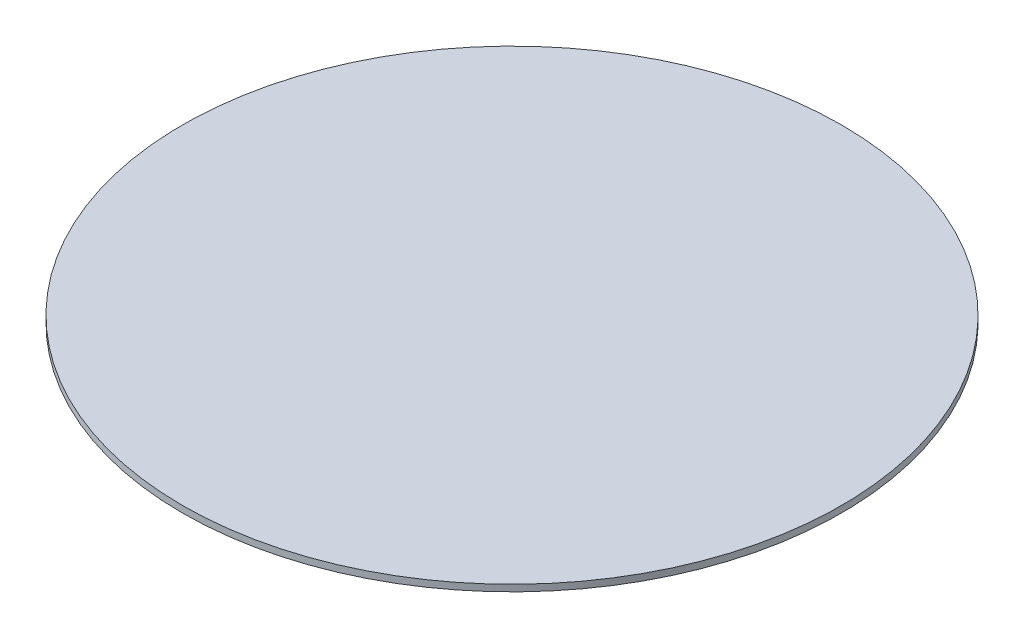
ISO-10303-21;
HEADER;
FILE_DESCRIPTION(('STEP AP214'),'2;1');
FILE_NAME('part.step','',(''),(''),'','','');
FILE_SCHEMA(('AUTOMOTIVE_DESIGN { 1 0 10303 214 1 1 1 1 }'));
ENDSEC;
DATA;
#1=APPLICATION_CONTEXT('core data for automotive mechanical design processes');
#2=APPLICATION_PROTOCOL_DEFINITION('international standard','automotive_design',2000,#1);
#3=PRODUCT_CONTEXT('',#1,'mechanical');
#4=PRODUCT('Part','Part','',(#3));
#5=PRODUCT_RELATED_PRODUCT_CATEGORY('part','',(#4));
#6=PRODUCT_DEFINITION_FORMATION('','',#4);
#7=PRODUCT_DEFINITION_CONTEXT('part definition',#1,'design');
#8=PRODUCT_DEFINITION('design','',#6,#7);
#9=PRODUCT_DEFINITION_SHAPE('','',#8);
#10=(LENGTH_UNIT() NAMED_UNIT(*) SI_UNIT(.MILLI.,.METRE.));
#11=(NAMED_UNIT(*) PLANE_ANGLE_UNIT() SI_UNIT($,.RADIAN.));
#12=(NAMED_UNIT(*) SI_UNIT($,.STERADIAN.) SOLID_ANGLE_UNIT());
#13=UNCERTAINTY_MEASURE_WITH_UNIT(LENGTH_MEASURE(1.E-05),#10,'distance_accuracy_value','');
#14=(GEOMETRIC_REPRESENTATION_CONTEXT(3) GLOBAL_UNCERTAINTY_ASSIGNED_CONTEXT((#13)) GLOBAL_UNIT_ASSIGNED_CONTEXT((#10,
#11,#12)) REPRESENTATION_CONTEXT('',''));
#15=CARTESIAN_POINT('',(0.,0.,0.));
#16=DIRECTION('',(0.,0.,1.));
#17=DIRECTION('',(1.,0.,0.));
#18=AXIS2_PLACEMENT_3D('',#15,#16,#17);
#19=CARTESIAN_POINT('',(0.,0.8,0.));
#20=DIRECTION('',(0.,-1.,0.));
#21=DIRECTION('',(0.,0.,-1.));
#22=AXIS2_PLACEMENT_3D('',#19,#20,#21);
#23=CYLINDRICAL_SURFACE('',#22,40.);
#24=CARTESIAN_POINT('',(0.,0.8,0.));
#25=DIRECTION('',(0.,1.,0.));
#26=DIRECTION('',(0.,0.,1.));
#27=AXIS2_PLACEMENT_3D('',#24,#25,#26);
#28=CIRCLE('',#27,40.);
#29=CARTESIAN_POINT('',(0.,0.8,40.));
#30=VERTEX_POINT('',#29);
#31=EDGE_CURVE('E10',#30,#30,#28,.T.);
#32=ORIENTED_EDGE('',*,*,#31,.F.);
#33=EDGE_LOOP('',(#32));
#34=FACE_BOUND('',#33,.T.);
#35=CARTESIAN_POINT('',(0.,0.,0.));
#36=DIRECTION('',(0.,1.,0.));
#37=DIRECTION('',(0.,0.,1.));
#38=AXIS2_PLACEMENT_3D('',#35,#36,#37);
#39=CIRCLE('',#38,40.);
#40=CARTESIAN_POINT('',(0.,0.,40.));
#41=VERTEX_POINT('',#40);
#42=EDGE_CURVE('E34',#41,#41,#39,.T.);
#43=ORIENTED_EDGE('',*,*,#42,.T.);
#44=EDGE_LOOP('',(#43));
#45=FACE_BOUND('',#44,.T.);
#46=ADVANCED_FACE('F31',(#34,#45),#23,.T.);
#47=CARTESIAN_POINT('',(0.,0.8,0.));
#48=DIRECTION('',(0.,1.,0.));
#49=DIRECTION('',(0.,0.,1.));
#50=AXIS2_PLACEMENT_3D('',#47,#48,#49);
#51=PLANE('',#50);
#52=ORIENTED_EDGE('',*,*,#31,.T.);
#53=EDGE_LOOP('',(#52));
#54=FACE_BOUND('',#53,.T.);
#55=ADVANCED_FACE('F46',(#54),#51,.T.);
#56=CARTESIAN_POINT('',(0.,0.,0.));
#57=DIRECTION('',(0.,1.,0.));
#58=DIRECTION('',(0.,0.,1.));
#59=AXIS2_PLACEMENT_3D('',#56,#57,#58);
#60=PLANE('',#59);
#61=ORIENTED_EDGE('',*,*,#42,.F.);
#62=EDGE_LOOP('',(#61));
#63=FACE_BOUND('',#62,.T.);
#64=ADVANCED_FACE('F44',(#63),#60,.F.);
#65=CLOSED_SHELL('',(#46,#55,#64));
#66=MANIFOLD_SOLID_BREP('B2',#65);
#67=ADVANCED_BREP_SHAPE_REPRESENTATION('',(#18,#66),#14);
#68=SHAPE_DEFINITION_REPRESENTATION(#9,#67);
ENDSEC;
END-ISO-10303-21;
